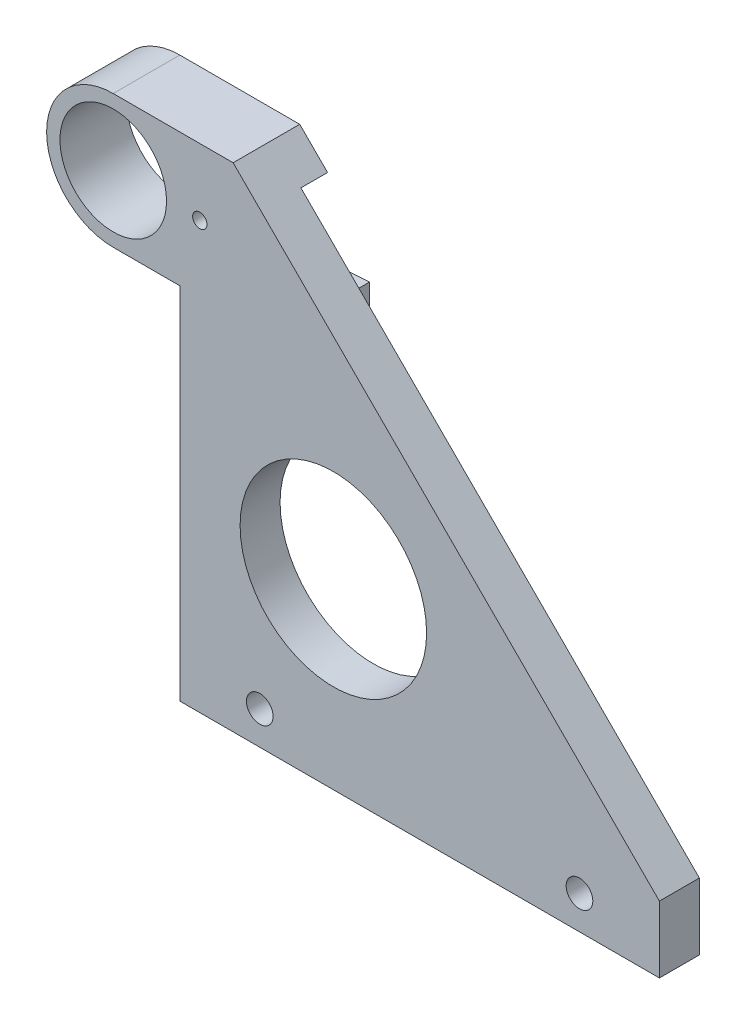
ISO-10303-21;
HEADER;
FILE_DESCRIPTION(('STEP AP214'),'2;1');
FILE_NAME('part.step','',(''),(''),'','','');
FILE_SCHEMA(('AUTOMOTIVE_DESIGN { 1 0 10303 214 1 1 1 1 }'));
ENDSEC;
DATA;
#1=APPLICATION_CONTEXT('core data for automotive mechanical design processes');
#2=APPLICATION_PROTOCOL_DEFINITION('international standard','automotive_design',2000,#1);
#3=PRODUCT_CONTEXT('',#1,'mechanical');
#4=PRODUCT('Part','Part','',(#3));
#5=PRODUCT_RELATED_PRODUCT_CATEGORY('part','',(#4));
#6=PRODUCT_DEFINITION_FORMATION('','',#4);
#7=PRODUCT_DEFINITION_CONTEXT('part definition',#1,'design');
#8=PRODUCT_DEFINITION('design','',#6,#7);
#9=PRODUCT_DEFINITION_SHAPE('','',#8);
#10=(LENGTH_UNIT() NAMED_UNIT(*) SI_UNIT(.MILLI.,.METRE.));
#11=(NAMED_UNIT(*) PLANE_ANGLE_UNIT() SI_UNIT($,.RADIAN.));
#12=(NAMED_UNIT(*) SI_UNIT($,.STERADIAN.) SOLID_ANGLE_UNIT());
#13=UNCERTAINTY_MEASURE_WITH_UNIT(LENGTH_MEASURE(1.E-05),#10,'distance_accuracy_value','');
#14=(GEOMETRIC_REPRESENTATION_CONTEXT(3) GLOBAL_UNCERTAINTY_ASSIGNED_CONTEXT((#13)) GLOBAL_UNIT_ASSIGNED_CONTEXT((#10,
#11,#12)) REPRESENTATION_CONTEXT('',''));
#15=CARTESIAN_POINT('',(0.,0.,0.));
#16=DIRECTION('',(0.,0.,1.));
#17=DIRECTION('',(1.,0.,0.));
#18=AXIS2_PLACEMENT_3D('',#15,#16,#17);
#19=CARTESIAN_POINT('',(12.,2.49999999999995,0.));
#20=DIRECTION('',(0.,0.,1.));
#21=DIRECTION('',(1.,0.,0.));
#22=AXIS2_PLACEMENT_3D('',#19,#20,#21);
#23=CYLINDRICAL_SURFACE('',#22,1.);
#24=CARTESIAN_POINT('',(12.,2.49999999999995,3.));
#25=DIRECTION('',(0.,0.,1.));
#26=DIRECTION('',(1.,0.,0.));
#27=AXIS2_PLACEMENT_3D('',#24,#25,#26);
#28=CIRCLE('',#27,1.);
#29=CARTESIAN_POINT('',(13.,2.49999999999995,3.));
#30=VERTEX_POINT('',#29);
#31=EDGE_CURVE('E182',#30,#30,#28,.T.);
#32=ORIENTED_EDGE('',*,*,#31,.T.);
#33=EDGE_LOOP('',(#32));
#34=FACE_BOUND('',#33,.T.);
#35=CARTESIAN_POINT('',(12.,2.49999999999995,1.5));
#36=DIRECTION('',(0.,0.,-1.));
#37=DIRECTION('',(-1.,0.,0.));
#38=AXIS2_PLACEMENT_3D('',#35,#36,#37);
#39=CIRCLE('',#38,1.);
#40=CARTESIAN_POINT('',(11.,2.49999999999995,1.5));
#41=VERTEX_POINT('',#40);
#42=EDGE_CURVE('E46',#41,#41,#39,.F.);
#43=ORIENTED_EDGE('',*,*,#42,.F.);
#44=EDGE_LOOP('',(#43));
#45=FACE_BOUND('',#44,.T.);
#46=ADVANCED_FACE('F41',(#34,#45),#23,.F.);
#47=CARTESIAN_POINT('',(-12.,2.49999999999995,0.));
#48=DIRECTION('',(0.,0.,1.));
#49=DIRECTION('',(1.,0.,0.));
#50=AXIS2_PLACEMENT_3D('',#47,#48,#49);
#51=CYLINDRICAL_SURFACE('',#50,1.);
#52=CARTESIAN_POINT('',(-12.,2.49999999999995,3.));
#53=DIRECTION('',(0.,0.,1.));
#54=DIRECTION('',(-1.,0.,0.));
#55=AXIS2_PLACEMENT_3D('',#52,#53,#54);
#56=CIRCLE('',#55,1.);
#57=CARTESIAN_POINT('',(-13.,2.49999999999995,3.));
#58=VERTEX_POINT('',#57);
#59=EDGE_CURVE('E179',#58,#58,#56,.T.);
#60=ORIENTED_EDGE('',*,*,#59,.T.);
#61=EDGE_LOOP('',(#60));
#62=FACE_BOUND('',#61,.T.);
#63=CARTESIAN_POINT('',(-12.,2.49999999999995,1.5));
#64=DIRECTION('',(0.,0.,-1.));
#65=DIRECTION('',(-1.,0.,0.));
#66=AXIS2_PLACEMENT_3D('',#63,#64,#65);
#67=CIRCLE('',#66,1.);
#68=CARTESIAN_POINT('',(-13.,2.49999999999995,1.5));
#69=VERTEX_POINT('',#68);
#70=EDGE_CURVE('E230',#69,#69,#67,.F.);
#71=ORIENTED_EDGE('',*,*,#70,.F.);
#72=EDGE_LOOP('',(#71));
#73=FACE_BOUND('',#72,.T.);
#74=ADVANCED_FACE('F298',(#62,#73),#51,.F.);
#75=CARTESIAN_POINT('',(-23.,32.,0.));
#76=DIRECTION('',(0.,0.,-1.));
#77=DIRECTION('',(-1.,0.,0.));
#78=AXIS2_PLACEMENT_3D('',#75,#76,#77);
#79=CYLINDRICAL_SURFACE('',#78,5.);
#80=DIRECTION('',(0.,0.,-1.));
#81=VECTOR('',#80,1.);
#82=CARTESIAN_POINT('',(-23.,37.,3.));
#83=LINE('',#82,#81);
#84=CARTESIAN_POINT('',(-23.,37.,-2.));
#85=VERTEX_POINT('',#84);
#86=CARTESIAN_POINT('',(-23.,37.,3.));
#87=VERTEX_POINT('',#86);
#88=EDGE_CURVE('E225',#85,#87,#83,.F.);
#89=ORIENTED_EDGE('',*,*,#88,.F.);
#90=CARTESIAN_POINT('',(-23.,32.,-2.));
#91=DIRECTION('',(0.,0.,-1.));
#92=DIRECTION('',(-1.,0.,0.));
#93=AXIS2_PLACEMENT_3D('',#90,#91,#92);
#94=CIRCLE('',#93,5.);
#95=CARTESIAN_POINT('',(-23.,27.,-2.));
#96=VERTEX_POINT('',#95);
#97=EDGE_CURVE('E161',#96,#85,#94,.T.);
#98=ORIENTED_EDGE('',*,*,#97,.F.);
#99=DIRECTION('',(0.,0.,-1.));
#100=VECTOR('',#99,1.);
#101=CARTESIAN_POINT('',(-23.,27.,3.));
#102=LINE('',#101,#100);
#103=CARTESIAN_POINT('',(-23.,27.,3.));
#104=VERTEX_POINT('',#103);
#105=EDGE_CURVE('E228',#104,#96,#102,.T.);
#106=ORIENTED_EDGE('',*,*,#105,.F.);
#107=CARTESIAN_POINT('',(-23.,32.,3.));
#108=DIRECTION('',(0.,0.,-1.));
#109=DIRECTION('',(-1.,0.,0.));
#110=AXIS2_PLACEMENT_3D('',#107,#108,#109);
#111=CIRCLE('',#110,5.);
#112=EDGE_CURVE('E51',#87,#104,#111,.F.);
#113=ORIENTED_EDGE('',*,*,#112,.F.);
#114=EDGE_LOOP('',(#89,#98,#106,#113));
#115=FACE_BOUND('',#114,.T.);
#116=ADVANCED_FACE('F44',(#115),#79,.T.);
#117=CARTESIAN_POINT('',(-28.,27.,3.));
#118=DIRECTION('',(0.,1.,0.));
#119=DIRECTION('',(-1.,0.,0.));
#120=AXIS2_PLACEMENT_3D('',#117,#118,#119);
#121=PLANE('',#120);
#122=DIRECTION('',(1.,0.,0.));
#123=VECTOR('',#122,1.);
#124=CARTESIAN_POINT('',(-28.,27.,3.));
#125=LINE('',#124,#123);
#126=CARTESIAN_POINT('',(-18.,27.,3.));
#127=VERTEX_POINT('',#126);
#128=EDGE_CURVE('E192',#104,#127,#125,.T.);
#129=ORIENTED_EDGE('',*,*,#128,.F.);
#130=ORIENTED_EDGE('',*,*,#105,.T.);
#131=DIRECTION('',(-1.,0.,0.));
#132=VECTOR('',#131,1.);
#133=CARTESIAN_POINT('',(-8.76991650325981,27.,-2.));
#134=LINE('',#133,#132);
#135=CARTESIAN_POINT('',(-8.76991650325981,27.,-2.));
#136=VERTEX_POINT('',#135);
#137=EDGE_CURVE('E171',#136,#96,#134,.T.);
#138=ORIENTED_EDGE('',*,*,#137,.F.);
#139=DIRECTION('',(0.,0.,1.));
#140=VECTOR('',#139,1.);
#141=CARTESIAN_POINT('',(-8.76991650325981,27.,-2.));
#142=LINE('',#141,#140);
#143=CARTESIAN_POINT('',(-8.76991650325981,27.,0.));
#144=VERTEX_POINT('',#143);
#145=EDGE_CURVE('E173',#136,#144,#142,.T.);
#146=ORIENTED_EDGE('',*,*,#145,.T.);
#147=DIRECTION('',(-1.,0.,0.));
#148=VECTOR('',#147,1.);
#149=CARTESIAN_POINT('',(-8.76991650325981,27.,0.));
#150=LINE('',#149,#148);
#151=CARTESIAN_POINT('',(-18.,27.,0.));
#152=VERTEX_POINT('',#151);
#153=EDGE_CURVE('E153',#144,#152,#150,.T.);
#154=ORIENTED_EDGE('',*,*,#153,.T.);
#155=DIRECTION('',(0.,0.,-1.));
#156=VECTOR('',#155,1.);
#157=CARTESIAN_POINT('',(-18.,27.,3.));
#158=LINE('',#157,#156);
#159=EDGE_CURVE('E222',#127,#152,#158,.T.);
#160=ORIENTED_EDGE('',*,*,#159,.F.);
#161=EDGE_LOOP('',(#129,#130,#138,#146,#154,#160));
#162=FACE_BOUND('',#161,.T.);
#163=ADVANCED_FACE('F333',(#162),#121,.F.);
#164=CARTESIAN_POINT('',(-18.,27.,3.));
#165=DIRECTION('',(1.,0.,0.));
#166=DIRECTION('',(0.,1.,0.));
#167=AXIS2_PLACEMENT_3D('',#164,#165,#166);
#168=PLANE('',#167);
#169=DIRECTION('',(0.,-1.,0.));
#170=VECTOR('',#169,1.);
#171=CARTESIAN_POINT('',(-18.,27.,0.));
#172=LINE('',#171,#170);
#173=CARTESIAN_POINT('',(-18.,0.,0.));
#174=VERTEX_POINT('',#173);
#175=EDGE_CURVE('E189',#152,#174,#172,.T.);
#176=ORIENTED_EDGE('',*,*,#175,.T.);
#177=DIRECTION('',(0.,0.,-1.));
#178=VECTOR('',#177,1.);
#179=CARTESIAN_POINT('',(-18.,0.,3.));
#180=LINE('',#179,#178);
#181=CARTESIAN_POINT('',(-18.,0.,3.));
#182=VERTEX_POINT('',#181);
#183=EDGE_CURVE('E219',#182,#174,#180,.T.);
#184=ORIENTED_EDGE('',*,*,#183,.F.);
#185=DIRECTION('',(0.,-1.,0.));
#186=VECTOR('',#185,1.);
#187=CARTESIAN_POINT('',(-18.,27.,3.));
#188=LINE('',#187,#186);
#189=EDGE_CURVE('E194',#127,#182,#188,.T.);
#190=ORIENTED_EDGE('',*,*,#189,.F.);
#191=ORIENTED_EDGE('',*,*,#159,.T.);
#192=EDGE_LOOP('',(#176,#184,#190,#191));
#193=FACE_BOUND('',#192,.T.);
#194=ADVANCED_FACE('F330',(#193),#168,.F.);
#195=CARTESIAN_POINT('',(-18.,0.,3.));
#196=DIRECTION('',(0.,1.,0.));
#197=DIRECTION('',(-1.,0.,0.));
#198=AXIS2_PLACEMENT_3D('',#195,#196,#197);
#199=PLANE('',#198);
#200=DIRECTION('',(1.,0.,0.));
#201=VECTOR('',#200,1.);
#202=CARTESIAN_POINT('',(-18.,0.,0.));
#203=LINE('',#202,#201);
#204=CARTESIAN_POINT('',(18.,0.,0.));
#205=VERTEX_POINT('',#204);
#206=EDGE_CURVE('E207',#174,#205,#203,.T.);
#207=ORIENTED_EDGE('',*,*,#206,.T.);
#208=DIRECTION('',(0.,0.,-1.));
#209=VECTOR('',#208,1.);
#210=CARTESIAN_POINT('',(18.,0.,3.));
#211=LINE('',#210,#209);
#212=CARTESIAN_POINT('',(18.,0.,3.));
#213=VERTEX_POINT('',#212);
#214=EDGE_CURVE('E216',#213,#205,#211,.T.);
#215=ORIENTED_EDGE('',*,*,#214,.F.);
#216=DIRECTION('',(1.,0.,0.));
#217=VECTOR('',#216,1.);
#218=CARTESIAN_POINT('',(-18.,0.,3.));
#219=LINE('',#218,#217);
#220=EDGE_CURVE('E197',#182,#213,#219,.T.);
#221=ORIENTED_EDGE('',*,*,#220,.F.);
#222=ORIENTED_EDGE('',*,*,#183,.T.);
#223=EDGE_LOOP('',(#207,#215,#221,#222));
#224=FACE_BOUND('',#223,.T.);
#225=ADVANCED_FACE('F327',(#224),#199,.F.);
#226=CARTESIAN_POINT('',(18.,0.,3.));
#227=DIRECTION('',(-1.,0.,0.));
#228=DIRECTION('',(0.,0.,1.));
#229=AXIS2_PLACEMENT_3D('',#226,#227,#228);
#230=PLANE('',#229);
#231=DIRECTION('',(0.,1.,0.));
#232=VECTOR('',#231,1.);
#233=CARTESIAN_POINT('',(18.,0.,0.));
#234=LINE('',#233,#232);
#235=CARTESIAN_POINT('',(18.,5.00000000000001,0.));
#236=VERTEX_POINT('',#235);
#237=EDGE_CURVE('E209',#205,#236,#234,.T.);
#238=ORIENTED_EDGE('',*,*,#237,.T.);
#239=DIRECTION('',(0.,0.,-1.));
#240=VECTOR('',#239,1.);
#241=CARTESIAN_POINT('',(18.,5.00000000000001,3.));
#242=LINE('',#241,#240);
#243=CARTESIAN_POINT('',(18.,5.00000000000001,3.));
#244=VERTEX_POINT('',#243);
#245=EDGE_CURVE('E213',#244,#236,#242,.T.);
#246=ORIENTED_EDGE('',*,*,#245,.F.);
#247=DIRECTION('',(0.,1.,0.));
#248=VECTOR('',#247,1.);
#249=CARTESIAN_POINT('',(18.,0.,3.));
#250=LINE('',#249,#248);
#251=EDGE_CURVE('E199',#213,#244,#250,.T.);
#252=ORIENTED_EDGE('',*,*,#251,.F.);
#253=ORIENTED_EDGE('',*,*,#214,.T.);
#254=EDGE_LOOP('',(#238,#246,#252,#253));
#255=FACE_BOUND('',#254,.T.);
#256=ADVANCED_FACE('F281',(#255),#230,.F.);
#257=CARTESIAN_POINT('',(18.,5.00000000000001,3.));
#258=DIRECTION('',(-0.707106781186549,-0.707106781186547,0.));
#259=DIRECTION('',(0.707106781186547,-0.707106781186549,0.));
#260=AXIS2_PLACEMENT_3D('',#257,#258,#259);
#261=PLANE('',#260);
#262=DIRECTION('',(-0.707106781186546,0.707106781186548,0.));
#263=VECTOR('',#262,1.);
#264=CARTESIAN_POINT('',(18.,5.00000000000001,0.));
#265=LINE('',#264,#263);
#266=CARTESIAN_POINT('',(-11.9097305394792,34.9097305394793,0.));
#267=VERTEX_POINT('',#266);
#268=EDGE_CURVE('E195',#236,#267,#265,.T.);
#269=ORIENTED_EDGE('',*,*,#268,.T.);
#270=DIRECTION('',(0.,0.,-1.));
#271=VECTOR('',#270,1.);
#272=CARTESIAN_POINT('',(-11.9097305394792,34.9097305394793,3.));
#273=LINE('',#272,#271);
#274=CARTESIAN_POINT('',(-11.9097305394792,34.9097305394793,-2.));
#275=VERTEX_POINT('',#274);
#276=EDGE_CURVE('E156',#267,#275,#273,.T.);
#277=ORIENTED_EDGE('',*,*,#276,.T.);
#278=DIRECTION('',(0.707106781186548,-0.707106781186548,0.));
#279=VECTOR('',#278,1.);
#280=CARTESIAN_POINT('',(-13.9999999999999,37.,-2.));
#281=LINE('',#280,#279);
#282=CARTESIAN_POINT('',(-13.9999999999999,37.,-2.));
#283=VERTEX_POINT('',#282);
#284=EDGE_CURVE('E167',#283,#275,#281,.T.);
#285=ORIENTED_EDGE('',*,*,#284,.F.);
#286=DIRECTION('',(0.,0.,-1.));
#287=VECTOR('',#286,1.);
#288=CARTESIAN_POINT('',(-13.9999999999999,37.,3.));
#289=LINE('',#288,#287);
#290=CARTESIAN_POINT('',(-13.9999999999999,37.,3.));
#291=VERTEX_POINT('',#290);
#292=EDGE_CURVE('E205',#291,#283,#289,.T.);
#293=ORIENTED_EDGE('',*,*,#292,.F.);
#294=DIRECTION('',(-0.707106781186546,0.707106781186548,0.));
#295=VECTOR('',#294,1.);
#296=CARTESIAN_POINT('',(18.,5.00000000000001,3.));
#297=LINE('',#296,#295);
#298=EDGE_CURVE('E201',#244,#291,#297,.T.);
#299=ORIENTED_EDGE('',*,*,#298,.F.);
#300=ORIENTED_EDGE('',*,*,#245,.T.);
#301=EDGE_LOOP('',(#269,#277,#285,#293,#299,#300));
#302=FACE_BOUND('',#301,.T.);
#303=ADVANCED_FACE('F264',(#302),#261,.F.);
#304=CARTESIAN_POINT('',(-13.9999999999999,37.,3.));
#305=DIRECTION('',(0.,-1.,0.));
#306=DIRECTION('',(1.,0.,0.));
#307=AXIS2_PLACEMENT_3D('',#304,#305,#306);
#308=PLANE('',#307);
#309=ORIENTED_EDGE('',*,*,#292,.T.);
#310=DIRECTION('',(1.,0.,0.));
#311=VECTOR('',#310,1.);
#312=CARTESIAN_POINT('',(-23.,37.,-2.));
#313=LINE('',#312,#311);
#314=EDGE_CURVE('E164',#85,#283,#313,.T.);
#315=ORIENTED_EDGE('',*,*,#314,.F.);
#316=ORIENTED_EDGE('',*,*,#88,.T.);
#317=DIRECTION('',(-1.,0.,0.));
#318=VECTOR('',#317,1.);
#319=CARTESIAN_POINT('',(-13.9999999999999,37.,3.));
#320=LINE('',#319,#318);
#321=EDGE_CURVE('E203',#291,#87,#320,.T.);
#322=ORIENTED_EDGE('',*,*,#321,.F.);
#323=EDGE_LOOP('',(#309,#315,#316,#322));
#324=FACE_BOUND('',#323,.T.);
#325=ADVANCED_FACE('F272',(#324),#308,.F.);
#326=CARTESIAN_POINT('',(0.,0.,3.));
#327=DIRECTION('',(0.,0.,-1.));
#328=DIRECTION('',(-1.,0.,0.));
#329=AXIS2_PLACEMENT_3D('',#326,#327,#328);
#330=PLANE('',#329);
#331=CARTESIAN_POINT('',(-16.5,32.,3.));
#332=DIRECTION('',(0.,0.,-1.));
#333=DIRECTION('',(-1.,0.,0.));
#334=AXIS2_PLACEMENT_3D('',#331,#332,#333);
#335=CIRCLE('',#334,0.53714125745292);
#336=CARTESIAN_POINT('',(-17.0371412574529,32.,3.));
#337=VERTEX_POINT('',#336);
#338=EDGE_CURVE('E237',#337,#337,#335,.T.);
#339=ORIENTED_EDGE('',*,*,#338,.T.);
#340=EDGE_LOOP('',(#339));
#341=FACE_BOUND('',#340,.T.);
#342=CARTESIAN_POINT('',(-23.,32.,3.));
#343=DIRECTION('',(0.,0.,1.));
#344=DIRECTION('',(1.,0.,0.));
#345=AXIS2_PLACEMENT_3D('',#342,#343,#344);
#346=CIRCLE('',#345,4.);
#347=CARTESIAN_POINT('',(-19.,32.,3.));
#348=VERTEX_POINT('',#347);
#349=EDGE_CURVE('E151',#348,#348,#346,.T.);
#350=ORIENTED_EDGE('',*,*,#349,.F.);
#351=EDGE_LOOP('',(#350));
#352=FACE_BOUND('',#351,.T.);
#353=ORIENTED_EDGE('',*,*,#59,.F.);
#354=EDGE_LOOP('',(#353));
#355=FACE_BOUND('',#354,.T.);
#356=ORIENTED_EDGE('',*,*,#31,.F.);
#357=EDGE_LOOP('',(#356));
#358=FACE_BOUND('',#357,.T.);
#359=CARTESIAN_POINT('',(-6.47635753390574,13.6875392105491,3.));
#360=DIRECTION('',(0.,0.,1.));
#361=DIRECTION('',(1.,0.,0.));
#362=AXIS2_PLACEMENT_3D('',#359,#360,#361);
#363=CIRCLE('',#362,7.);
#364=CARTESIAN_POINT('',(0.523642466094258,13.6875392105491,3.));
#365=VERTEX_POINT('',#364);
#366=EDGE_CURVE('E185',#365,#365,#363,.T.);
#367=ORIENTED_EDGE('',*,*,#366,.F.);
#368=EDGE_LOOP('',(#367));
#369=FACE_BOUND('',#368,.T.);
#370=ORIENTED_EDGE('',*,*,#321,.T.);
#371=ORIENTED_EDGE('',*,*,#112,.T.);
#372=ORIENTED_EDGE('',*,*,#128,.T.);
#373=ORIENTED_EDGE('',*,*,#189,.T.);
#374=ORIENTED_EDGE('',*,*,#220,.T.);
#375=ORIENTED_EDGE('',*,*,#251,.T.);
#376=ORIENTED_EDGE('',*,*,#298,.T.);
#377=EDGE_LOOP('',(#370,#371,#372,#373,#374,#375,#376));
#378=FACE_BOUND('',#377,.T.);
#379=ADVANCED_FACE('F276',(#341,#352,#355,#358,#369,#378),#330,.F.);
#380=CARTESIAN_POINT('',(0.,0.,0.));
#381=DIRECTION('',(0.,0.,-1.));
#382=DIRECTION('',(-1.,0.,0.));
#383=AXIS2_PLACEMENT_3D('',#380,#381,#382);
#384=PLANE('',#383);
#385=CARTESIAN_POINT('',(12.,2.49999999999995,0.));
#386=DIRECTION('',(0.,0.,-1.));
#387=DIRECTION('',(-1.,0.,0.));
#388=AXIS2_PLACEMENT_3D('',#385,#386,#387);
#389=CIRCLE('',#388,1.85);
#390=CARTESIAN_POINT('',(10.15,2.49999999999995,0.));
#391=VERTEX_POINT('',#390);
#392=EDGE_CURVE('E247',#391,#391,#389,.T.);
#393=ORIENTED_EDGE('',*,*,#392,.F.);
#394=EDGE_LOOP('',(#393));
#395=FACE_BOUND('',#394,.T.);
#396=CARTESIAN_POINT('',(-12.,2.49999999999995,0.));
#397=DIRECTION('',(0.,0.,-1.));
#398=DIRECTION('',(-1.,0.,0.));
#399=AXIS2_PLACEMENT_3D('',#396,#397,#398);
#400=CIRCLE('',#399,1.85);
#401=CARTESIAN_POINT('',(-13.85,2.49999999999995,0.));
#402=VERTEX_POINT('',#401);
#403=EDGE_CURVE('E240',#402,#402,#400,.T.);
#404=ORIENTED_EDGE('',*,*,#403,.F.);
#405=EDGE_LOOP('',(#404));
#406=FACE_BOUND('',#405,.T.);
#407=CARTESIAN_POINT('',(-16.5,32.,0.));
#408=DIRECTION('',(0.,0.,-1.));
#409=DIRECTION('',(-1.,0.,0.));
#410=AXIS2_PLACEMENT_3D('',#407,#408,#409);
#411=CIRCLE('',#410,0.53714125745292);
#412=CARTESIAN_POINT('',(-17.0371412574529,32.,0.));
#413=VERTEX_POINT('',#412);
#414=EDGE_CURVE('E232',#413,#413,#411,.T.);
#415=ORIENTED_EDGE('',*,*,#414,.F.);
#416=EDGE_LOOP('',(#415));
#417=FACE_BOUND('',#416,.T.);
#418=DIRECTION('',(0.,-1.,0.));
#419=VECTOR('',#418,1.);
#420=CARTESIAN_POINT('',(-8.76991650325977,31.7699165032599,0.));
#421=LINE('',#420,#419);
#422=CARTESIAN_POINT('',(-8.76991650325979,29.3573561388861,0.));
#423=VERTEX_POINT('',#422);
#424=EDGE_CURVE('E150',#423,#144,#421,.T.);
#425=ORIENTED_EDGE('',*,*,#424,.F.);
#426=DIRECTION('',(0.997822540918993,0.0659558703525614,0.));
#427=VECTOR('',#426,1.);
#428=CARTESIAN_POINT('',(-20.9747127910058,28.5506215456861,0.));
#429=LINE('',#428,#427);
#430=CARTESIAN_POINT('',(-20.9747127910058,28.5506215456861,0.));
#431=VERTEX_POINT('',#430);
#432=EDGE_CURVE('E252',#431,#423,#429,.T.);
#433=ORIENTED_EDGE('',*,*,#432,.F.);
#434=CARTESIAN_POINT('',(-23.,32.,0.));
#435=DIRECTION('',(0.,0.,-1.));
#436=DIRECTION('',(-1.,0.,0.));
#437=AXIS2_PLACEMENT_3D('',#434,#435,#436);
#438=CIRCLE('',#437,4.);
#439=CARTESIAN_POINT('',(-20.9747127910058,35.4493784543138,0.));
#440=VERTEX_POINT('',#439);
#441=EDGE_CURVE('E11',#431,#440,#438,.F.);
#442=ORIENTED_EDGE('',*,*,#441,.T.);
#443=DIRECTION('',(-0.998232722987987,0.05942584249289,0.));
#444=VECTOR('',#443,1.);
#445=CARTESIAN_POINT('',(-7.02133985441122,34.6187195074776,0.));
#446=LINE('',#445,#444);
#447=EDGE_CURVE('E254',#267,#440,#446,.T.);
#448=ORIENTED_EDGE('',*,*,#447,.F.);
#449=ORIENTED_EDGE('',*,*,#268,.F.);
#450=ORIENTED_EDGE('',*,*,#237,.F.);
#451=ORIENTED_EDGE('',*,*,#206,.F.);
#452=ORIENTED_EDGE('',*,*,#175,.F.);
#453=ORIENTED_EDGE('',*,*,#153,.F.);
#454=EDGE_LOOP('',(#425,#433,#442,#448,#449,#450,#451,#452,#453));
#455=FACE_BOUND('',#454,.T.);
#456=CARTESIAN_POINT('',(-6.47635753390574,13.6875392105491,0.));
#457=DIRECTION('',(0.,0.,1.));
#458=DIRECTION('',(1.,0.,0.));
#459=AXIS2_PLACEMENT_3D('',#456,#457,#458);
#460=CIRCLE('',#459,7.);
#461=CARTESIAN_POINT('',(0.523642466094258,13.6875392105491,0.));
#462=VERTEX_POINT('',#461);
#463=EDGE_CURVE('E186',#462,#462,#460,.T.);
#464=ORIENTED_EDGE('',*,*,#463,.T.);
#465=EDGE_LOOP('',(#464));
#466=FACE_BOUND('',#465,.T.);
#467=ADVANCED_FACE('F285',(#395,#406,#417,#455,#466),#384,.T.);
#468=CARTESIAN_POINT('',(-6.47635753390574,13.6875392105491,0.));
#469=DIRECTION('',(0.,0.,1.));
#470=DIRECTION('',(1.,0.,0.));
#471=AXIS2_PLACEMENT_3D('',#468,#469,#470);
#472=CYLINDRICAL_SURFACE('',#471,7.);
#473=ORIENTED_EDGE('',*,*,#463,.F.);
#474=EDGE_LOOP('',(#473));
#475=FACE_BOUND('',#474,.T.);
#476=ORIENTED_EDGE('',*,*,#366,.T.);
#477=EDGE_LOOP('',(#476));
#478=FACE_BOUND('',#477,.T.);
#479=ADVANCED_FACE('F310',(#475,#478),#472,.F.);
#480=CARTESIAN_POINT('',(-8.76991650325977,31.7699165032599,-2.));
#481=DIRECTION('',(-1.,0.,0.));
#482=DIRECTION('',(0.,-1.,0.));
#483=AXIS2_PLACEMENT_3D('',#480,#481,#482);
#484=PLANE('',#483);
#485=DIRECTION('',(0.,-1.,0.));
#486=VECTOR('',#485,1.);
#487=CARTESIAN_POINT('',(-8.76991650325977,31.7699165032599,-2.));
#488=LINE('',#487,#486);
#489=CARTESIAN_POINT('',(-8.76991650325977,29.3573561388861,-2.));
#490=VERTEX_POINT('',#489);
#491=EDGE_CURVE('E169',#490,#136,#488,.T.);
#492=ORIENTED_EDGE('',*,*,#491,.F.);
#493=DIRECTION('',(0.,0.,1.));
#494=VECTOR('',#493,1.);
#495=CARTESIAN_POINT('',(-8.76991650325979,29.3573561388861,-2.));
#496=LINE('',#495,#494);
#497=EDGE_CURVE('E132',#490,#423,#496,.T.);
#498=ORIENTED_EDGE('',*,*,#497,.T.);
#499=ORIENTED_EDGE('',*,*,#424,.T.);
#500=ORIENTED_EDGE('',*,*,#145,.F.);
#501=EDGE_LOOP('',(#492,#498,#499,#500));
#502=FACE_BOUND('',#501,.T.);
#503=ADVANCED_FACE('F313',(#502),#484,.F.);
#504=CARTESIAN_POINT('',(-23.,32.,-2.));
#505=DIRECTION('',(0.,0.,-1.));
#506=DIRECTION('',(-1.,0.,0.));
#507=AXIS2_PLACEMENT_3D('',#504,#505,#506);
#508=PLANE('',#507);
#509=DIRECTION('',(0.998232722987986,-0.05942584249289,0.));
#510=VECTOR('',#509,1.);
#511=CARTESIAN_POINT('',(-7.02133985441122,34.6187195074776,-2.));
#512=LINE('',#511,#510);
#513=CARTESIAN_POINT('',(-20.9747127910058,35.4493784543138,-2.));
#514=VERTEX_POINT('',#513);
#515=EDGE_CURVE('E136',#514,#275,#512,.T.);
#516=ORIENTED_EDGE('',*,*,#515,.F.);
#517=CARTESIAN_POINT('',(-23.,32.,-2.));
#518=DIRECTION('',(0.,0.,1.));
#519=DIRECTION('',(1.,0.,0.));
#520=AXIS2_PLACEMENT_3D('',#517,#518,#519);
#521=CIRCLE('',#520,4.);
#522=CARTESIAN_POINT('',(-20.9747127910058,28.5506215456861,-2.));
#523=VERTEX_POINT('',#522);
#524=EDGE_CURVE('E144',#514,#523,#521,.T.);
#525=ORIENTED_EDGE('',*,*,#524,.T.);
#526=DIRECTION('',(-0.997822540918993,-0.0659558703525614,0.));
#527=VECTOR('',#526,1.);
#528=CARTESIAN_POINT('',(-20.9747127910058,28.5506215456861,-2.));
#529=LINE('',#528,#527);
#530=EDGE_CURVE('E129',#490,#523,#529,.T.);
#531=ORIENTED_EDGE('',*,*,#530,.F.);
#532=ORIENTED_EDGE('',*,*,#491,.T.);
#533=ORIENTED_EDGE('',*,*,#137,.T.);
#534=ORIENTED_EDGE('',*,*,#97,.T.);
#535=ORIENTED_EDGE('',*,*,#314,.T.);
#536=ORIENTED_EDGE('',*,*,#284,.T.);
#537=EDGE_LOOP('',(#516,#525,#531,#532,#533,#534,#535,#536));
#538=FACE_BOUND('',#537,.T.);
#539=ADVANCED_FACE('F148',(#538),#508,.T.);
#540=CARTESIAN_POINT('',(-23.,32.,-2.));
#541=DIRECTION('',(0.,0.,1.));
#542=DIRECTION('',(1.,0.,0.));
#543=AXIS2_PLACEMENT_3D('',#540,#541,#542);
#544=CYLINDRICAL_SURFACE('',#543,4.);
#545=ORIENTED_EDGE('',*,*,#524,.F.);
#546=DIRECTION('',(0.,0.,-1.));
#547=VECTOR('',#546,1.);
#548=CARTESIAN_POINT('',(-20.9747127910058,35.4493784543138,15.5656501050238));
#549=LINE('',#548,#547);
#550=EDGE_CURVE('E145',#440,#514,#549,.T.);
#551=ORIENTED_EDGE('',*,*,#550,.F.);
#552=ORIENTED_EDGE('',*,*,#441,.F.);
#553=DIRECTION('',(0.,0.,-1.));
#554=VECTOR('',#553,1.);
#555=CARTESIAN_POINT('',(-20.9747127910058,28.5506215456861,15.5656501050238));
#556=LINE('',#555,#554);
#557=EDGE_CURVE('E59',#431,#523,#556,.T.);
#558=ORIENTED_EDGE('',*,*,#557,.T.);
#559=EDGE_LOOP('',(#545,#551,#552,#558));
#560=FACE_BOUND('',#559,.T.);
#561=ORIENTED_EDGE('',*,*,#349,.T.);
#562=EDGE_LOOP('',(#561));
#563=FACE_BOUND('',#562,.T.);
#564=ADVANCED_FACE('F141',(#560,#563),#544,.F.);
#565=CARTESIAN_POINT('',(-7.02133985441122,34.6187195074776,15.5656501050238));
#566=DIRECTION('',(0.05942584249289,0.998232722987986,0.));
#567=DIRECTION('',(-0.998232722987987,0.05942584249289,0.));
#568=AXIS2_PLACEMENT_3D('',#565,#566,#567);
#569=PLANE('',#568);
#570=ORIENTED_EDGE('',*,*,#447,.T.);
#571=ORIENTED_EDGE('',*,*,#550,.T.);
#572=ORIENTED_EDGE('',*,*,#515,.T.);
#573=ORIENTED_EDGE('',*,*,#276,.F.);
#574=EDGE_LOOP('',(#570,#571,#572,#573));
#575=FACE_BOUND('',#574,.T.);
#576=ADVANCED_FACE('F287',(#575),#569,.F.);
#577=CARTESIAN_POINT('',(-20.9747127910058,28.5506215456861,15.5656501050238));
#578=DIRECTION('',(0.0659558703525614,-0.997822540918993,0.));
#579=DIRECTION('',(0.997822540918993,0.0659558703525614,0.));
#580=AXIS2_PLACEMENT_3D('',#577,#578,#579);
#581=PLANE('',#580);
#582=ORIENTED_EDGE('',*,*,#530,.T.);
#583=ORIENTED_EDGE('',*,*,#557,.F.);
#584=ORIENTED_EDGE('',*,*,#432,.T.);
#585=ORIENTED_EDGE('',*,*,#497,.F.);
#586=EDGE_LOOP('',(#582,#583,#584,#585));
#587=FACE_BOUND('',#586,.T.);
#588=ADVANCED_FACE('F130',(#587),#581,.F.);
#589=CARTESIAN_POINT('',(-16.5,32.,3.));
#590=DIRECTION('',(0.,0.,-1.));
#591=DIRECTION('',(-1.,0.,0.));
#592=AXIS2_PLACEMENT_3D('',#589,#590,#591);
#593=CYLINDRICAL_SURFACE('',#592,0.53714125745292);
#594=ORIENTED_EDGE('',*,*,#338,.F.);
#595=EDGE_LOOP('',(#594));
#596=FACE_BOUND('',#595,.T.);
#597=ORIENTED_EDGE('',*,*,#414,.T.);
#598=EDGE_LOOP('',(#597));
#599=FACE_BOUND('',#598,.T.);
#600=ADVANCED_FACE('F294',(#596,#599),#593,.F.);
#601=CARTESIAN_POINT('',(-12.,2.49999999999995,1.5));
#602=DIRECTION('',(0.,0.,-1.));
#603=DIRECTION('',(-1.,0.,0.));
#604=AXIS2_PLACEMENT_3D('',#601,#602,#603);
#605=PLANE('',#604);
#606=CARTESIAN_POINT('',(-12.,2.49999999999995,1.5));
#607=DIRECTION('',(0.,0.,-1.));
#608=DIRECTION('',(-1.,0.,0.));
#609=AXIS2_PLACEMENT_3D('',#606,#607,#608);
#610=CIRCLE('',#609,1.85);
#611=CARTESIAN_POINT('',(-13.85,2.49999999999995,1.5));
#612=VERTEX_POINT('',#611);
#613=EDGE_CURVE('E233',#612,#612,#610,.T.);
#614=ORIENTED_EDGE('',*,*,#613,.T.);
#615=EDGE_LOOP('',(#614));
#616=FACE_BOUND('',#615,.T.);
#617=ORIENTED_EDGE('',*,*,#70,.T.);
#618=EDGE_LOOP('',(#617));
#619=FACE_BOUND('',#618,.T.);
#620=ADVANCED_FACE('F381',(#616,#619),#605,.T.);
#621=CARTESIAN_POINT('',(-12.,2.49999999999995,1.5));
#622=DIRECTION('',(0.,0.,-1.));
#623=DIRECTION('',(-1.,0.,0.));
#624=AXIS2_PLACEMENT_3D('',#621,#622,#623);
#625=CYLINDRICAL_SURFACE('',#624,1.85);
#626=ORIENTED_EDGE('',*,*,#613,.F.);
#627=EDGE_LOOP('',(#626));
#628=FACE_BOUND('',#627,.T.);
#629=ORIENTED_EDGE('',*,*,#403,.T.);
#630=EDGE_LOOP('',(#629));
#631=FACE_BOUND('',#630,.T.);
#632=ADVANCED_FACE('F394',(#628,#631),#625,.F.);
#633=CARTESIAN_POINT('',(12.,2.49999999999995,1.5));
#634=DIRECTION('',(0.,0.,-1.));
#635=DIRECTION('',(-1.,0.,0.));
#636=AXIS2_PLACEMENT_3D('',#633,#634,#635);
#637=PLANE('',#636);
#638=CARTESIAN_POINT('',(12.,2.49999999999995,1.5));
#639=DIRECTION('',(0.,0.,-1.));
#640=DIRECTION('',(-1.,0.,0.));
#641=AXIS2_PLACEMENT_3D('',#638,#639,#640);
#642=CIRCLE('',#641,1.85);
#643=CARTESIAN_POINT('',(10.15,2.49999999999995,1.5));
#644=VERTEX_POINT('',#643);
#645=EDGE_CURVE('E422',#644,#644,#642,.T.);
#646=ORIENTED_EDGE('',*,*,#645,.T.);
#647=EDGE_LOOP('',(#646));
#648=FACE_BOUND('',#647,.T.);
#649=ORIENTED_EDGE('',*,*,#42,.T.);
#650=EDGE_LOOP('',(#649));
#651=FACE_BOUND('',#650,.T.);
#652=ADVANCED_FACE('F401',(#648,#651),#637,.T.);
#653=CARTESIAN_POINT('',(12.,2.49999999999995,1.5));
#654=DIRECTION('',(0.,0.,-1.));
#655=DIRECTION('',(-1.,0.,0.));
#656=AXIS2_PLACEMENT_3D('',#653,#654,#655);
#657=CYLINDRICAL_SURFACE('',#656,1.85);
#658=ORIENTED_EDGE('',*,*,#645,.F.);
#659=EDGE_LOOP('',(#658));
#660=FACE_BOUND('',#659,.T.);
#661=ORIENTED_EDGE('',*,*,#392,.T.);
#662=EDGE_LOOP('',(#661));
#663=FACE_BOUND('',#662,.T.);
#664=ADVANCED_FACE('F409',(#660,#663),#657,.F.);
#665=CLOSED_SHELL('',(#46,#74,#116,#163,#194,#225,#256,#303,#325,#379,#467,#479,#503,#539,#564,
#576,#588,#600,#620,#632,#652,#664));
#666=MANIFOLD_SOLID_BREP('B2',#665);
#667=ADVANCED_BREP_SHAPE_REPRESENTATION('',(#18,#666),#14);
#668=SHAPE_DEFINITION_REPRESENTATION(#9,#667);
ENDSEC;
END-ISO-10303-21;
